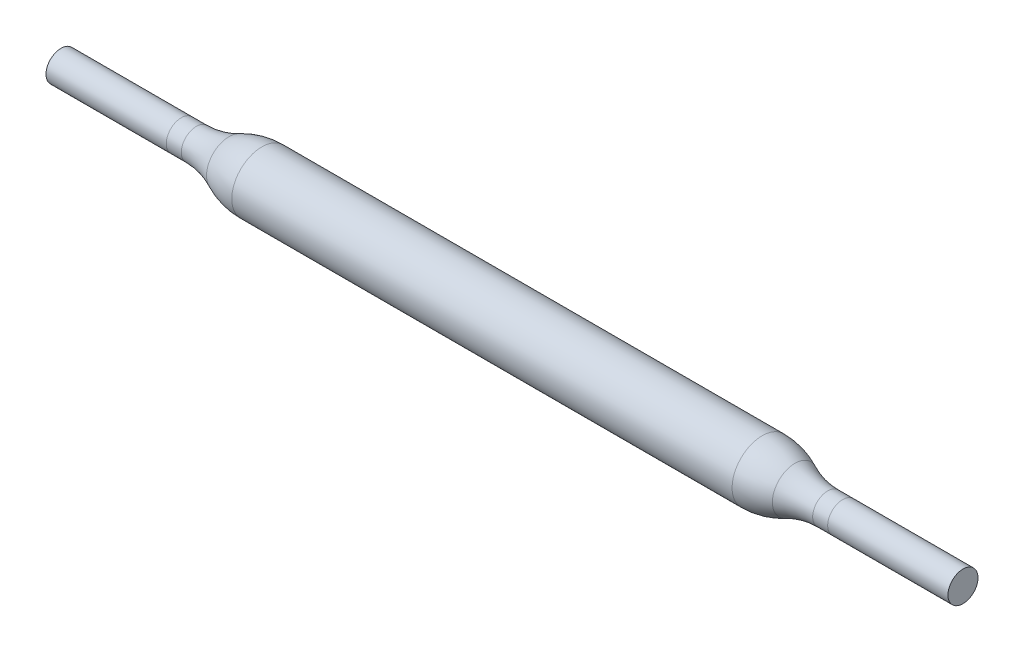
ISO-10303-21;
HEADER;
FILE_DESCRIPTION(('STEP AP214'),'2;1');
FILE_NAME('part.step','',(''),(''),'','','');
FILE_SCHEMA(('AUTOMOTIVE_DESIGN { 1 0 10303 214 1 1 1 1 }'));
ENDSEC;
DATA;
#1=APPLICATION_CONTEXT('core data for automotive mechanical design processes');
#2=APPLICATION_PROTOCOL_DEFINITION('international standard','automotive_design',2000,#1);
#3=PRODUCT_CONTEXT('',#1,'mechanical');
#4=PRODUCT('Part','Part','',(#3));
#5=PRODUCT_RELATED_PRODUCT_CATEGORY('part','',(#4));
#6=PRODUCT_DEFINITION_FORMATION('','',#4);
#7=PRODUCT_DEFINITION_CONTEXT('part definition',#1,'design');
#8=PRODUCT_DEFINITION('design','',#6,#7);
#9=PRODUCT_DEFINITION_SHAPE('','',#8);
#10=(LENGTH_UNIT() NAMED_UNIT(*) SI_UNIT(.MILLI.,.METRE.));
#11=(NAMED_UNIT(*) PLANE_ANGLE_UNIT() SI_UNIT($,.RADIAN.));
#12=(NAMED_UNIT(*) SI_UNIT($,.STERADIAN.) SOLID_ANGLE_UNIT());
#13=UNCERTAINTY_MEASURE_WITH_UNIT(LENGTH_MEASURE(1.E-05),#10,'distance_accuracy_value','');
#14=(GEOMETRIC_REPRESENTATION_CONTEXT(3) GLOBAL_UNCERTAINTY_ASSIGNED_CONTEXT((#13)) GLOBAL_UNIT_ASSIGNED_CONTEXT((#10,
#11,#12)) REPRESENTATION_CONTEXT('',''));
#15=CARTESIAN_POINT('',(0.,0.,0.));
#16=DIRECTION('',(0.,0.,1.));
#17=DIRECTION('',(1.,0.,0.));
#18=AXIS2_PLACEMENT_3D('',#15,#16,#17);
#19=CARTESIAN_POINT('',(-540.,-1.98392781461871E-13,0.));
#20=DIRECTION('',(-1.,0.,0.));
#21=DIRECTION('',(0.,-1.,0.));
#22=AXIS2_PLACEMENT_3D('',#19,#20,#21);
#23=CYLINDRICAL_SURFACE('',#22,18.0000000000001);
#24=CARTESIAN_POINT('',(378.,0.,0.));
#25=DIRECTION('',(-1.,0.,0.));
#26=DIRECTION('',(0.,-1.,0.));
#27=AXIS2_PLACEMENT_3D('',#24,#25,#26);
#28=CIRCLE('',#27,18.);
#29=CARTESIAN_POINT('',(378.,-18.,0.));
#30=VERTEX_POINT('',#29);
#31=EDGE_CURVE('E62',#30,#30,#28,.T.);
#32=ORIENTED_EDGE('',*,*,#31,.F.);
#33=EDGE_LOOP('',(#32));
#34=FACE_BOUND('',#33,.T.);
#35=CARTESIAN_POINT('',(396.,0.,0.));
#36=DIRECTION('',(1.,0.,0.));
#37=DIRECTION('',(0.,0.,-1.));
#38=AXIS2_PLACEMENT_3D('',#35,#36,#37);
#39=CIRCLE('',#38,18.0000000000001);
#40=CARTESIAN_POINT('',(396.,0.,-18.0000000000001));
#41=VERTEX_POINT('',#40);
#42=EDGE_CURVE('E10',#41,#41,#39,.T.);
#43=ORIENTED_EDGE('',*,*,#42,.F.);
#44=EDGE_LOOP('',(#43));
#45=FACE_BOUND('',#44,.T.);
#46=ADVANCED_FACE('F42',(#34,#45),#23,.T.);
#47=CARTESIAN_POINT('',(-540.,-1.98392781461871E-13,0.));
#48=DIRECTION('',(-1.,0.,0.));
#49=DIRECTION('',(0.,-1.,0.));
#50=AXIS2_PLACEMENT_3D('',#47,#48,#49);
#51=CYLINDRICAL_SURFACE('',#50,18.0000000000001);
#52=CARTESIAN_POINT('',(-540.,-1.98392781461871E-13,0.));
#53=DIRECTION('',(-1.,0.,0.));
#54=DIRECTION('',(0.,-1.,0.));
#55=AXIS2_PLACEMENT_3D('',#52,#53,#54);
#56=CIRCLE('',#55,18.0000000000002);
#57=CARTESIAN_POINT('',(-540.,-18.0000000000004,0.));
#58=VERTEX_POINT('',#57);
#59=EDGE_CURVE('E88',#58,#58,#56,.T.);
#60=ORIENTED_EDGE('',*,*,#59,.F.);
#61=EDGE_LOOP('',(#60));
#62=FACE_BOUND('',#61,.T.);
#63=CARTESIAN_POINT('',(-396.,-1.71940410600288E-13,0.));
#64=DIRECTION('',(1.,0.,0.));
#65=DIRECTION('',(0.,0.,-1.));
#66=AXIS2_PLACEMENT_3D('',#63,#64,#65);
#67=CIRCLE('',#66,18.0000000000001);
#68=CARTESIAN_POINT('',(-396.,-1.71940410600288E-13,-18.0000000000001));
#69=VERTEX_POINT('',#68);
#70=EDGE_CURVE('E50',#69,#69,#67,.T.);
#71=ORIENTED_EDGE('',*,*,#70,.F.);
#72=EDGE_LOOP('',(#71));
#73=FACE_BOUND('',#72,.T.);
#74=ADVANCED_FACE('F94',(#62,#73),#51,.T.);
#75=CARTESIAN_POINT('',(-540.,-1.98392781461871E-13,0.));
#76=DIRECTION('',(1.,0.,0.));
#77=DIRECTION('',(0.,1.,0.));
#78=AXIS2_PLACEMENT_3D('',#75,#76,#77);
#79=PLANE('',#78);
#80=ORIENTED_EDGE('',*,*,#59,.T.);
#81=EDGE_LOOP('',(#80));
#82=FACE_BOUND('',#81,.T.);
#83=ADVANCED_FACE('F44',(#82),#79,.F.);
#84=CARTESIAN_POINT('',(540.,0.,0.));
#85=DIRECTION('',(-1.,0.,0.));
#86=DIRECTION('',(0.,-1.,0.));
#87=AXIS2_PLACEMENT_3D('',#84,#85,#86);
#88=PLANE('',#87);
#89=CARTESIAN_POINT('',(540.,0.,0.));
#90=DIRECTION('',(-1.,0.,0.));
#91=DIRECTION('',(0.,-1.,0.));
#92=AXIS2_PLACEMENT_3D('',#89,#90,#91);
#93=CIRCLE('',#92,18.0000000000002);
#94=CARTESIAN_POINT('',(540.,-18.0000000000002,0.));
#95=VERTEX_POINT('',#94);
#96=EDGE_CURVE('E56',#95,#95,#93,.T.);
#97=ORIENTED_EDGE('',*,*,#96,.F.);
#98=EDGE_LOOP('',(#97));
#99=FACE_BOUND('',#98,.T.);
#100=ADVANCED_FACE('F103',(#99),#88,.F.);
#101=ORIENTED_EDGE('',*,*,#42,.T.);
#102=EDGE_LOOP('',(#101));
#103=FACE_BOUND('',#102,.T.);
#104=ORIENTED_EDGE('',*,*,#96,.T.);
#105=EDGE_LOOP('',(#104));
#106=FACE_BOUND('',#105,.T.);
#107=ADVANCED_FACE('F106',(#103,#106),#23,.T.);
#108=CARTESIAN_POINT('',(378.,0.,0.));
#109=DIRECTION('',(-1.,0.,0.));
#110=DIRECTION('',(0.,-1.,0.));
#111=AXIS2_PLACEMENT_3D('',#108,#109,#110);
#112=TOROIDAL_SURFACE('',#111,108.,89.9999999999999);
#113=CARTESIAN_POINT('',(338.769909508134,0.,0.));
#114=DIRECTION('',(-1.,0.,0.));
#115=DIRECTION('',(0.,-1.,0.));
#116=AXIS2_PLACEMENT_3D('',#113,#114,#115);
#117=CIRCLE('',#116,26.9999999999999);
#118=CARTESIAN_POINT('',(338.769909508134,-27.,0.));
#119=VERTEX_POINT('',#118);
#120=EDGE_CURVE('E68',#119,#119,#117,.T.);
#121=ORIENTED_EDGE('',*,*,#120,.F.);
#122=EDGE_LOOP('',(#121));
#123=FACE_BOUND('',#122,.T.);
#124=ORIENTED_EDGE('',*,*,#31,.T.);
#125=EDGE_LOOP('',(#124));
#126=FACE_BOUND('',#125,.T.);
#127=ADVANCED_FACE('F134',(#123,#126),#112,.F.);
#128=CARTESIAN_POINT('',(299.539819016268,0.,0.));
#129=DIRECTION('',(-1.,0.,0.));
#130=DIRECTION('',(0.,-1.,0.));
#131=AXIS2_PLACEMENT_3D('',#128,#129,#130);
#132=DEGENERATE_TOROIDAL_SURFACE('',#131,54.0000000000001,90.,.F.);
#133=CARTESIAN_POINT('',(299.539819016268,0.,0.));
#134=DIRECTION('',(-1.,0.,0.));
#135=DIRECTION('',(0.,-1.,0.));
#136=AXIS2_PLACEMENT_3D('',#133,#134,#135);
#137=CIRCLE('',#136,35.9999999999998);
#138=CARTESIAN_POINT('',(299.539819016268,-35.9999999999999,0.));
#139=VERTEX_POINT('',#138);
#140=EDGE_CURVE('E72',#139,#139,#137,.T.);
#141=ORIENTED_EDGE('',*,*,#140,.F.);
#142=EDGE_LOOP('',(#141));
#143=FACE_BOUND('',#142,.T.);
#144=ORIENTED_EDGE('',*,*,#120,.T.);
#145=EDGE_LOOP('',(#144));
#146=FACE_BOUND('',#145,.T.);
#147=ADVANCED_FACE('F128',(#143,#146),#132,.F.);
#148=CARTESIAN_POINT('',(-540.,-1.98392781461871E-13,0.));
#149=DIRECTION('',(-1.,0.,0.));
#150=DIRECTION('',(0.,-1.,0.));
#151=AXIS2_PLACEMENT_3D('',#148,#149,#150);
#152=CYLINDRICAL_SURFACE('',#151,35.9999999999999);
#153=CARTESIAN_POINT('',(-299.539819016268,-1.54220962817253E-13,0.));
#154=DIRECTION('',(-1.,0.,0.));
#155=DIRECTION('',(0.,-1.,0.));
#156=AXIS2_PLACEMENT_3D('',#153,#154,#155);
#157=CIRCLE('',#156,36.);
#158=CARTESIAN_POINT('',(-299.539819016268,-36.0000000000001,0.));
#159=VERTEX_POINT('',#158);
#160=EDGE_CURVE('E76',#159,#159,#157,.T.);
#161=ORIENTED_EDGE('',*,*,#160,.F.);
#162=EDGE_LOOP('',(#161));
#163=FACE_BOUND('',#162,.T.);
#164=ORIENTED_EDGE('',*,*,#140,.T.);
#165=EDGE_LOOP('',(#164));
#166=FACE_BOUND('',#165,.T.);
#167=ADVANCED_FACE('F122',(#163,#166),#152,.T.);
#168=CARTESIAN_POINT('',(-299.539819016268,-1.48318857196017E-13,0.));
#169=DIRECTION('',(-1.,0.,0.));
#170=DIRECTION('',(0.,-1.,0.));
#171=AXIS2_PLACEMENT_3D('',#168,#169,#170);
#172=DEGENERATE_TOROIDAL_SURFACE('',#171,54.,90.,.F.);
#173=CARTESIAN_POINT('',(-338.769909508134,-1.61427413529922E-13,0.));
#174=DIRECTION('',(-1.,0.,0.));
#175=DIRECTION('',(0.,-1.,0.));
#176=AXIS2_PLACEMENT_3D('',#173,#174,#175);
#177=CIRCLE('',#176,27.);
#178=CARTESIAN_POINT('',(-338.769909508134,-27.0000000000002,0.));
#179=VERTEX_POINT('',#178);
#180=EDGE_CURVE('E80',#179,#179,#177,.T.);
#181=ORIENTED_EDGE('',*,*,#180,.F.);
#182=EDGE_LOOP('',(#181));
#183=FACE_BOUND('',#182,.T.);
#184=ORIENTED_EDGE('',*,*,#160,.T.);
#185=EDGE_LOOP('',(#184));
#186=FACE_BOUND('',#185,.T.);
#187=ADVANCED_FACE('F113',(#183,#186),#172,.F.);
#188=CARTESIAN_POINT('',(-378.,-1.71737624121704E-13,0.));
#189=DIRECTION('',(-1.,0.,0.));
#190=DIRECTION('',(0.,-1.,0.));
#191=AXIS2_PLACEMENT_3D('',#188,#189,#190);
#192=TOROIDAL_SURFACE('',#191,108.,89.9999999999999);
#193=CARTESIAN_POINT('',(-378.,-1.68633864242591E-13,0.));
#194=DIRECTION('',(-1.,0.,0.));
#195=DIRECTION('',(0.,-1.,0.));
#196=AXIS2_PLACEMENT_3D('',#193,#194,#195);
#197=CIRCLE('',#196,18.0000000000001);
#198=CARTESIAN_POINT('',(-378.,-18.0000000000002,0.));
#199=VERTEX_POINT('',#198);
#200=EDGE_CURVE('E84',#199,#199,#197,.T.);
#201=ORIENTED_EDGE('',*,*,#200,.F.);
#202=EDGE_LOOP('',(#201));
#203=FACE_BOUND('',#202,.T.);
#204=ORIENTED_EDGE('',*,*,#180,.T.);
#205=EDGE_LOOP('',(#204));
#206=FACE_BOUND('',#205,.T.);
#207=ADVANCED_FACE('F109',(#203,#206),#192,.F.);
#208=ORIENTED_EDGE('',*,*,#70,.T.);
#209=EDGE_LOOP('',(#208));
#210=FACE_BOUND('',#209,.T.);
#211=ORIENTED_EDGE('',*,*,#200,.T.);
#212=EDGE_LOOP('',(#211));
#213=FACE_BOUND('',#212,.T.);
#214=ADVANCED_FACE('F98',(#210,#213),#51,.T.);
#215=CLOSED_SHELL('',(#46,#74,#83,#100,#107,#127,#147,#167,#187,#207,#214));
#216=MANIFOLD_SOLID_BREP('B2',#215);
#217=ADVANCED_BREP_SHAPE_REPRESENTATION('',(#18,#216),#14);
#218=SHAPE_DEFINITION_REPRESENTATION(#9,#217);
ENDSEC;
END-ISO-10303-21;
